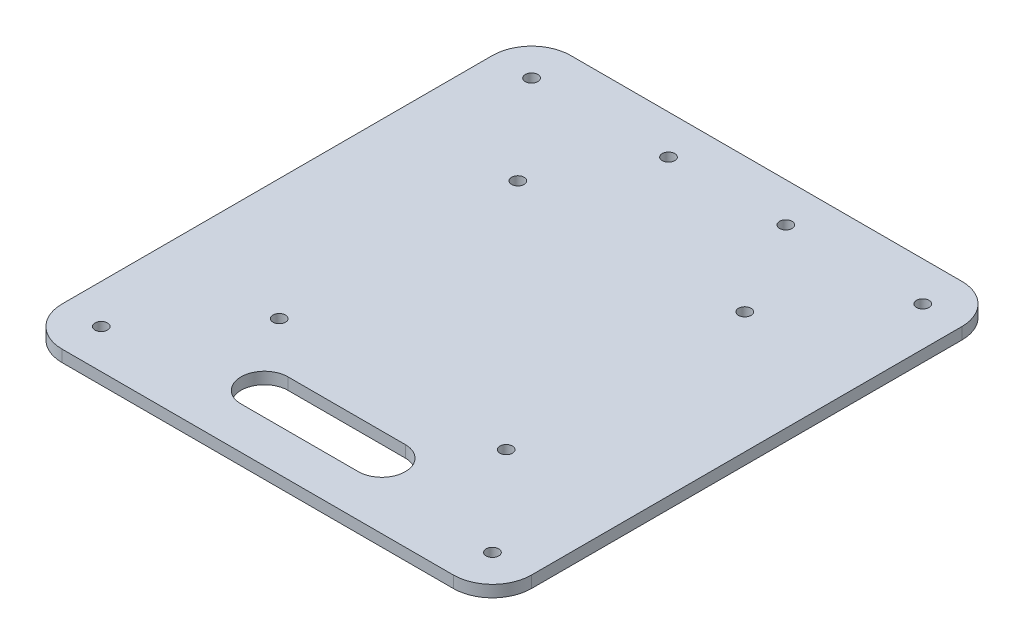
ISO-10303-21;
HEADER;
FILE_DESCRIPTION(('STEP AP214'),'2;1');
FILE_NAME('part.step','',(''),(''),'','','');
FILE_SCHEMA(('AUTOMOTIVE_DESIGN { 1 0 10303 214 1 1 1 1 }'));
ENDSEC;
DATA;
#1=APPLICATION_CONTEXT('core data for automotive mechanical design processes');
#2=APPLICATION_PROTOCOL_DEFINITION('international standard','automotive_design',2000,#1);
#3=PRODUCT_CONTEXT('',#1,'mechanical');
#4=PRODUCT('Part','Part','',(#3));
#5=PRODUCT_RELATED_PRODUCT_CATEGORY('part','',(#4));
#6=PRODUCT_DEFINITION_FORMATION('','',#4);
#7=PRODUCT_DEFINITION_CONTEXT('part definition',#1,'design');
#8=PRODUCT_DEFINITION('design','',#6,#7);
#9=PRODUCT_DEFINITION_SHAPE('','',#8);
#10=(LENGTH_UNIT() NAMED_UNIT(*) SI_UNIT(.MILLI.,.METRE.));
#11=(NAMED_UNIT(*) PLANE_ANGLE_UNIT() SI_UNIT($,.RADIAN.));
#12=(NAMED_UNIT(*) SI_UNIT($,.STERADIAN.) SOLID_ANGLE_UNIT());
#13=UNCERTAINTY_MEASURE_WITH_UNIT(LENGTH_MEASURE(1.E-05),#10,'distance_accuracy_value','');
#14=(GEOMETRIC_REPRESENTATION_CONTEXT(3) GLOBAL_UNCERTAINTY_ASSIGNED_CONTEXT((#13)) GLOBAL_UNIT_ASSIGNED_CONTEXT((#10,
#11,#12)) REPRESENTATION_CONTEXT('',''));
#15=CARTESIAN_POINT('',(0.,0.,0.));
#16=DIRECTION('',(0.,0.,1.));
#17=DIRECTION('',(1.,0.,0.));
#18=AXIS2_PLACEMENT_3D('',#15,#16,#17);
#19=CARTESIAN_POINT('',(-50.,3.,55.));
#20=DIRECTION('',(0.,1.,0.));
#21=DIRECTION('',(0.,0.,1.));
#22=AXIS2_PLACEMENT_3D('',#19,#20,#21);
#23=PLANE('',#22);
#24=CARTESIAN_POINT('',(-15.,3.,-55.));
#25=DIRECTION('',(0.,1.,0.));
#26=DIRECTION('',(0.,0.,1.));
#27=AXIS2_PLACEMENT_3D('',#24,#25,#26);
#28=CIRCLE('',#27,1.6);
#29=CARTESIAN_POINT('',(-15.,3.,-53.4));
#30=VERTEX_POINT('',#29);
#31=EDGE_CURVE('E407',#30,#30,#28,.T.);
#32=ORIENTED_EDGE('',*,*,#31,.F.);
#33=EDGE_LOOP('',(#32));
#34=FACE_BOUND('',#33,.T.);
#35=CARTESIAN_POINT('',(15.,3.,-55.));
#36=DIRECTION('',(0.,1.,0.));
#37=DIRECTION('',(0.,0.,1.));
#38=AXIS2_PLACEMENT_3D('',#35,#36,#37);
#39=CIRCLE('',#38,1.6);
#40=CARTESIAN_POINT('',(15.,3.,-53.4));
#41=VERTEX_POINT('',#40);
#42=EDGE_CURVE('E409',#41,#41,#39,.T.);
#43=ORIENTED_EDGE('',*,*,#42,.F.);
#44=EDGE_LOOP('',(#43));
#45=FACE_BOUND('',#44,.T.);
#46=CARTESIAN_POINT('',(-29.,3.,-30.5));
#47=DIRECTION('',(0.,1.,0.));
#48=DIRECTION('',(0.,0.,1.));
#49=AXIS2_PLACEMENT_3D('',#46,#47,#48);
#50=CIRCLE('',#49,1.6);
#51=CARTESIAN_POINT('',(-29.,3.,-32.1));
#52=VERTEX_POINT('',#51);
#53=EDGE_CURVE('E449',#52,#52,#50,.F.);
#54=ORIENTED_EDGE('',*,*,#53,.T.);
#55=EDGE_LOOP('',(#54));
#56=FACE_BOUND('',#55,.T.);
#57=CARTESIAN_POINT('',(29.,3.,30.5));
#58=DIRECTION('',(0.,1.,0.));
#59=DIRECTION('',(0.,0.,1.));
#60=AXIS2_PLACEMENT_3D('',#57,#58,#59);
#61=CIRCLE('',#60,1.6);
#62=CARTESIAN_POINT('',(29.,3.,28.9));
#63=VERTEX_POINT('',#62);
#64=EDGE_CURVE('E445',#63,#63,#61,.F.);
#65=ORIENTED_EDGE('',*,*,#64,.T.);
#66=EDGE_LOOP('',(#65));
#67=FACE_BOUND('',#66,.T.);
#68=CARTESIAN_POINT('',(-29.,3.,30.5));
#69=DIRECTION('',(0.,1.,0.));
#70=DIRECTION('',(0.,0.,1.));
#71=AXIS2_PLACEMENT_3D('',#68,#69,#70);
#72=CIRCLE('',#71,1.6);
#73=CARTESIAN_POINT('',(-29.,3.,28.9));
#74=VERTEX_POINT('',#73);
#75=EDGE_CURVE('E441',#74,#74,#72,.F.);
#76=ORIENTED_EDGE('',*,*,#75,.T.);
#77=EDGE_LOOP('',(#76));
#78=FACE_BOUND('',#77,.T.);
#79=CARTESIAN_POINT('',(29.,3.,-30.5));
#80=DIRECTION('',(0.,1.,0.));
#81=DIRECTION('',(0.,0.,1.));
#82=AXIS2_PLACEMENT_3D('',#79,#80,#81);
#83=CIRCLE('',#82,1.6);
#84=CARTESIAN_POINT('',(29.,3.,-32.1));
#85=VERTEX_POINT('',#84);
#86=EDGE_CURVE('E437',#85,#85,#83,.F.);
#87=ORIENTED_EDGE('',*,*,#86,.T.);
#88=EDGE_LOOP('',(#87));
#89=FACE_BOUND('',#88,.T.);
#90=CARTESIAN_POINT('',(-50.,3.,-55.));
#91=DIRECTION('',(0.,1.,0.));
#92=DIRECTION('',(0.,0.,-1.));
#93=AXIS2_PLACEMENT_3D('',#90,#91,#92);
#94=CIRCLE('',#93,1.59999999999997);
#95=CARTESIAN_POINT('',(-50.,3.,-56.6));
#96=VERTEX_POINT('',#95);
#97=EDGE_CURVE('E169',#96,#96,#94,.T.);
#98=ORIENTED_EDGE('',*,*,#97,.F.);
#99=EDGE_LOOP('',(#98));
#100=FACE_BOUND('',#99,.T.);
#101=CARTESIAN_POINT('',(50.,3.,-55.));
#102=DIRECTION('',(0.,1.,0.));
#103=DIRECTION('',(0.,0.,1.));
#104=AXIS2_PLACEMENT_3D('',#101,#102,#103);
#105=CIRCLE('',#104,1.6);
#106=CARTESIAN_POINT('',(50.,3.,-53.4));
#107=VERTEX_POINT('',#106);
#108=EDGE_CURVE('E193',#107,#107,#105,.T.);
#109=ORIENTED_EDGE('',*,*,#108,.F.);
#110=EDGE_LOOP('',(#109));
#111=FACE_BOUND('',#110,.T.);
#112=CARTESIAN_POINT('',(-50.,3.,55.));
#113=DIRECTION('',(0.,1.,0.));
#114=DIRECTION('',(0.,0.,1.));
#115=AXIS2_PLACEMENT_3D('',#112,#113,#114);
#116=CIRCLE('',#115,9.99999999999999);
#117=CARTESIAN_POINT('',(-60.,3.,54.9999999999999));
#118=VERTEX_POINT('',#117);
#119=CARTESIAN_POINT('',(-49.9999999999999,3.,65.));
#120=VERTEX_POINT('',#119);
#121=EDGE_CURVE('E201',#118,#120,#116,.T.);
#122=ORIENTED_EDGE('',*,*,#121,.T.);
#123=DIRECTION('',(1.,0.,0.));
#124=VECTOR('',#123,1.);
#125=CARTESIAN_POINT('',(-49.9999999999999,3.,65.));
#126=LINE('',#125,#124);
#127=CARTESIAN_POINT('',(49.9999999999999,3.,65.));
#128=VERTEX_POINT('',#127);
#129=EDGE_CURVE('E205',#120,#128,#126,.T.);
#130=ORIENTED_EDGE('',*,*,#129,.T.);
#131=CARTESIAN_POINT('',(50.,3.,55.));
#132=DIRECTION('',(0.,1.,0.));
#133=DIRECTION('',(0.,0.,1.));
#134=AXIS2_PLACEMENT_3D('',#131,#132,#133);
#135=CIRCLE('',#134,9.99999999999999);
#136=CARTESIAN_POINT('',(60.,3.,54.9999999999999));
#137=VERTEX_POINT('',#136);
#138=EDGE_CURVE('E209',#128,#137,#135,.T.);
#139=ORIENTED_EDGE('',*,*,#138,.T.);
#140=DIRECTION('',(0.,0.,-1.));
#141=VECTOR('',#140,1.);
#142=CARTESIAN_POINT('',(60.,3.,-54.9999999999999));
#143=LINE('',#142,#141);
#144=CARTESIAN_POINT('',(60.,3.,-54.9999999999999));
#145=VERTEX_POINT('',#144);
#146=EDGE_CURVE('E212',#137,#145,#143,.T.);
#147=ORIENTED_EDGE('',*,*,#146,.T.);
#148=CARTESIAN_POINT('',(50.,3.,-55.));
#149=DIRECTION('',(0.,1.,0.));
#150=DIRECTION('',(0.,0.,-1.));
#151=AXIS2_PLACEMENT_3D('',#148,#149,#150);
#152=CIRCLE('',#151,9.99999999999999);
#153=CARTESIAN_POINT('',(49.9999999999999,3.,-65.));
#154=VERTEX_POINT('',#153);
#155=EDGE_CURVE('E215',#145,#154,#152,.T.);
#156=ORIENTED_EDGE('',*,*,#155,.T.);
#157=DIRECTION('',(-1.,0.,0.));
#158=VECTOR('',#157,1.);
#159=CARTESIAN_POINT('',(-49.9999999999999,3.,-65.));
#160=LINE('',#159,#158);
#161=CARTESIAN_POINT('',(-49.9999999999999,3.,-65.));
#162=VERTEX_POINT('',#161);
#163=EDGE_CURVE('E218',#154,#162,#160,.T.);
#164=ORIENTED_EDGE('',*,*,#163,.T.);
#165=CARTESIAN_POINT('',(-50.,3.,-55.));
#166=DIRECTION('',(0.,1.,0.));
#167=DIRECTION('',(0.,0.,1.));
#168=AXIS2_PLACEMENT_3D('',#165,#166,#167);
#169=CIRCLE('',#168,9.99999999999999);
#170=CARTESIAN_POINT('',(-60.,3.,-54.9999999999999));
#171=VERTEX_POINT('',#170);
#172=EDGE_CURVE('E221',#162,#171,#169,.T.);
#173=ORIENTED_EDGE('',*,*,#172,.T.);
#174=DIRECTION('',(0.,0.,1.));
#175=VECTOR('',#174,1.);
#176=CARTESIAN_POINT('',(-60.,3.,-54.9999999999999));
#177=LINE('',#176,#175);
#178=EDGE_CURVE('E224',#171,#118,#177,.T.);
#179=ORIENTED_EDGE('',*,*,#178,.T.);
#180=EDGE_LOOP('',(#122,#130,#139,#147,#156,#164,#173,#179));
#181=FACE_BOUND('',#180,.T.);
#182=CARTESIAN_POINT('',(-50.,3.,55.));
#183=DIRECTION('',(0.,1.,0.));
#184=DIRECTION('',(0.,0.,1.));
#185=AXIS2_PLACEMENT_3D('',#182,#183,#184);
#186=CIRCLE('',#185,1.60000000000008);
#187=CARTESIAN_POINT('',(-50.,3.,56.6000000000001));
#188=VERTEX_POINT('',#187);
#189=EDGE_CURVE('E185',#188,#188,#186,.T.);
#190=ORIENTED_EDGE('',*,*,#189,.F.);
#191=EDGE_LOOP('',(#190));
#192=FACE_BOUND('',#191,.T.);
#193=DIRECTION('',(1.,0.,0.));
#194=VECTOR('',#193,1.);
#195=CARTESIAN_POINT('',(-15.,3.,54.2679851551916));
#196=LINE('',#195,#194);
#197=CARTESIAN_POINT('',(-15.,3.,54.2679851551916));
#198=VERTEX_POINT('',#197);
#199=CARTESIAN_POINT('',(15.,3.,54.2679851551916));
#200=VERTEX_POINT('',#199);
#201=EDGE_CURVE('E143',#198,#200,#196,.T.);
#202=ORIENTED_EDGE('',*,*,#201,.F.);
#203=CARTESIAN_POINT('',(-15.,3.,48.2679851551916));
#204=DIRECTION('',(0.,1.,0.));
#205=DIRECTION('',(0.,0.,1.));
#206=AXIS2_PLACEMENT_3D('',#203,#204,#205);
#207=CIRCLE('',#206,6.);
#208=CARTESIAN_POINT('',(-15.,3.,42.2679851551916));
#209=VERTEX_POINT('',#208);
#210=EDGE_CURVE('E134',#209,#198,#207,.T.);
#211=ORIENTED_EDGE('',*,*,#210,.F.);
#212=DIRECTION('',(-1.,0.,0.));
#213=VECTOR('',#212,1.);
#214=CARTESIAN_POINT('',(-15.,3.,42.2679851551916));
#215=LINE('',#214,#213);
#216=CARTESIAN_POINT('',(15.,3.,42.2679851551916));
#217=VERTEX_POINT('',#216);
#218=EDGE_CURVE('E161',#217,#209,#215,.T.);
#219=ORIENTED_EDGE('',*,*,#218,.F.);
#220=CARTESIAN_POINT('',(15.,3.,48.2679851551916));
#221=DIRECTION('',(0.,1.,0.));
#222=DIRECTION('',(0.,0.,1.));
#223=AXIS2_PLACEMENT_3D('',#220,#221,#222);
#224=CIRCLE('',#223,6.);
#225=EDGE_CURVE('E157',#200,#217,#224,.T.);
#226=ORIENTED_EDGE('',*,*,#225,.F.);
#227=EDGE_LOOP('',(#202,#211,#219,#226));
#228=FACE_BOUND('',#227,.T.);
#229=CARTESIAN_POINT('',(50.,3.,55.));
#230=DIRECTION('',(0.,1.,0.));
#231=DIRECTION('',(0.,0.,-1.));
#232=AXIS2_PLACEMENT_3D('',#229,#230,#231);
#233=CIRCLE('',#232,1.60000000000001);
#234=CARTESIAN_POINT('',(50.,3.,53.4));
#235=VERTEX_POINT('',#234);
#236=EDGE_CURVE('E454',#235,#235,#233,.T.);
#237=ORIENTED_EDGE('',*,*,#236,.F.);
#238=EDGE_LOOP('',(#237));
#239=FACE_BOUND('',#238,.T.);
#240=ADVANCED_FACE('F44',(#34,#45,#56,#67,#78,#89,#100,#111,#181,#192,#228,#239),#23,.T.);
#241=CARTESIAN_POINT('',(-50.,0.,55.));
#242=DIRECTION('',(0.,1.,0.));
#243=DIRECTION('',(0.,0.,1.));
#244=AXIS2_PLACEMENT_3D('',#241,#242,#243);
#245=PLANE('',#244);
#246=CARTESIAN_POINT('',(-15.,0.,-55.));
#247=DIRECTION('',(0.,1.,0.));
#248=DIRECTION('',(0.,0.,1.));
#249=AXIS2_PLACEMENT_3D('',#246,#247,#248);
#250=CIRCLE('',#249,1.6);
#251=CARTESIAN_POINT('',(-15.,0.,-53.4));
#252=VERTEX_POINT('',#251);
#253=EDGE_CURVE('E405',#252,#252,#250,.T.);
#254=ORIENTED_EDGE('',*,*,#253,.T.);
#255=EDGE_LOOP('',(#254));
#256=FACE_BOUND('',#255,.T.);
#257=CARTESIAN_POINT('',(15.,0.,-55.));
#258=DIRECTION('',(0.,1.,0.));
#259=DIRECTION('',(0.,0.,1.));
#260=AXIS2_PLACEMENT_3D('',#257,#258,#259);
#261=CIRCLE('',#260,1.6);
#262=CARTESIAN_POINT('',(15.,0.,-53.4));
#263=VERTEX_POINT('',#262);
#264=EDGE_CURVE('E416',#263,#263,#261,.T.);
#265=ORIENTED_EDGE('',*,*,#264,.T.);
#266=EDGE_LOOP('',(#265));
#267=FACE_BOUND('',#266,.T.);
#268=CARTESIAN_POINT('',(-29.,0.,-30.5));
#269=DIRECTION('',(0.,1.,0.));
#270=DIRECTION('',(0.,0.,1.));
#271=AXIS2_PLACEMENT_3D('',#268,#269,#270);
#272=CIRCLE('',#271,1.6);
#273=CARTESIAN_POINT('',(-29.,0.,-32.1));
#274=VERTEX_POINT('',#273);
#275=EDGE_CURVE('E426',#274,#274,#272,.T.);
#276=ORIENTED_EDGE('',*,*,#275,.T.);
#277=EDGE_LOOP('',(#276));
#278=FACE_BOUND('',#277,.T.);
#279=CARTESIAN_POINT('',(29.,0.,30.5));
#280=DIRECTION('',(0.,1.,0.));
#281=DIRECTION('',(0.,0.,1.));
#282=AXIS2_PLACEMENT_3D('',#279,#280,#281);
#283=CIRCLE('',#282,1.6);
#284=CARTESIAN_POINT('',(29.,0.,28.9));
#285=VERTEX_POINT('',#284);
#286=EDGE_CURVE('E425',#285,#285,#283,.T.);
#287=ORIENTED_EDGE('',*,*,#286,.T.);
#288=EDGE_LOOP('',(#287));
#289=FACE_BOUND('',#288,.T.);
#290=CARTESIAN_POINT('',(-29.,0.,30.5));
#291=DIRECTION('',(0.,1.,0.));
#292=DIRECTION('',(0.,0.,1.));
#293=AXIS2_PLACEMENT_3D('',#290,#291,#292);
#294=CIRCLE('',#293,1.6);
#295=CARTESIAN_POINT('',(-29.,0.,28.9));
#296=VERTEX_POINT('',#295);
#297=EDGE_CURVE('E413',#296,#296,#294,.T.);
#298=ORIENTED_EDGE('',*,*,#297,.T.);
#299=EDGE_LOOP('',(#298));
#300=FACE_BOUND('',#299,.T.);
#301=CARTESIAN_POINT('',(29.,0.,-30.5));
#302=DIRECTION('',(0.,1.,0.));
#303=DIRECTION('',(0.,0.,1.));
#304=AXIS2_PLACEMENT_3D('',#301,#302,#303);
#305=CIRCLE('',#304,1.6);
#306=CARTESIAN_POINT('',(29.,0.,-32.1));
#307=VERTEX_POINT('',#306);
#308=EDGE_CURVE('E430',#307,#307,#305,.T.);
#309=ORIENTED_EDGE('',*,*,#308,.T.);
#310=EDGE_LOOP('',(#309));
#311=FACE_BOUND('',#310,.T.);
#312=CARTESIAN_POINT('',(-50.,0.,55.));
#313=DIRECTION('',(0.,1.,0.));
#314=DIRECTION('',(0.,0.,1.));
#315=AXIS2_PLACEMENT_3D('',#312,#313,#314);
#316=CIRCLE('',#315,1.60000000000008);
#317=CARTESIAN_POINT('',(-50.,0.,56.6000000000001));
#318=VERTEX_POINT('',#317);
#319=EDGE_CURVE('E152',#318,#318,#316,.T.);
#320=ORIENTED_EDGE('',*,*,#319,.T.);
#321=EDGE_LOOP('',(#320));
#322=FACE_BOUND('',#321,.T.);
#323=CARTESIAN_POINT('',(50.,0.,-55.));
#324=DIRECTION('',(0.,1.,0.));
#325=DIRECTION('',(0.,0.,1.));
#326=AXIS2_PLACEMENT_3D('',#323,#324,#325);
#327=CIRCLE('',#326,1.6);
#328=CARTESIAN_POINT('',(50.,0.,-53.4));
#329=VERTEX_POINT('',#328);
#330=EDGE_CURVE('E189',#329,#329,#327,.T.);
#331=ORIENTED_EDGE('',*,*,#330,.T.);
#332=EDGE_LOOP('',(#331));
#333=FACE_BOUND('',#332,.T.);
#334=CARTESIAN_POINT('',(-50.,0.,55.));
#335=DIRECTION('',(0.,1.,0.));
#336=DIRECTION('',(0.,0.,1.));
#337=AXIS2_PLACEMENT_3D('',#334,#335,#336);
#338=CIRCLE('',#337,9.99999999999999);
#339=CARTESIAN_POINT('',(-60.,0.,54.9999999999999));
#340=VERTEX_POINT('',#339);
#341=CARTESIAN_POINT('',(-49.9999999999999,0.,65.));
#342=VERTEX_POINT('',#341);
#343=EDGE_CURVE('E197',#340,#342,#338,.T.);
#344=ORIENTED_EDGE('',*,*,#343,.F.);
#345=DIRECTION('',(0.,0.,1.));
#346=VECTOR('',#345,1.);
#347=CARTESIAN_POINT('',(-60.,0.,-54.9999999999999));
#348=LINE('',#347,#346);
#349=CARTESIAN_POINT('',(-60.,0.,-54.9999999999999));
#350=VERTEX_POINT('',#349);
#351=EDGE_CURVE('E206',#350,#340,#348,.T.);
#352=ORIENTED_EDGE('',*,*,#351,.F.);
#353=CARTESIAN_POINT('',(-50.,0.,-55.));
#354=DIRECTION('',(0.,1.,0.));
#355=DIRECTION('',(0.,0.,1.));
#356=AXIS2_PLACEMENT_3D('',#353,#354,#355);
#357=CIRCLE('',#356,9.99999999999999);
#358=CARTESIAN_POINT('',(-49.9999999999999,0.,-65.));
#359=VERTEX_POINT('',#358);
#360=EDGE_CURVE('E246',#359,#350,#357,.T.);
#361=ORIENTED_EDGE('',*,*,#360,.F.);
#362=DIRECTION('',(-1.,0.,0.));
#363=VECTOR('',#362,1.);
#364=CARTESIAN_POINT('',(-49.9999999999999,0.,-65.));
#365=LINE('',#364,#363);
#366=CARTESIAN_POINT('',(49.9999999999999,0.,-65.));
#367=VERTEX_POINT('',#366);
#368=EDGE_CURVE('E243',#367,#359,#365,.T.);
#369=ORIENTED_EDGE('',*,*,#368,.F.);
#370=CARTESIAN_POINT('',(50.,0.,-55.));
#371=DIRECTION('',(0.,1.,0.));
#372=DIRECTION('',(0.,0.,-1.));
#373=AXIS2_PLACEMENT_3D('',#370,#371,#372);
#374=CIRCLE('',#373,9.99999999999999);
#375=CARTESIAN_POINT('',(60.,0.,-54.9999999999999));
#376=VERTEX_POINT('',#375);
#377=EDGE_CURVE('E240',#376,#367,#374,.T.);
#378=ORIENTED_EDGE('',*,*,#377,.F.);
#379=DIRECTION('',(0.,0.,-1.));
#380=VECTOR('',#379,1.);
#381=CARTESIAN_POINT('',(60.,0.,-54.9999999999999));
#382=LINE('',#381,#380);
#383=CARTESIAN_POINT('',(60.,0.,54.9999999999999));
#384=VERTEX_POINT('',#383);
#385=EDGE_CURVE('E237',#384,#376,#382,.T.);
#386=ORIENTED_EDGE('',*,*,#385,.F.);
#387=CARTESIAN_POINT('',(50.,0.,55.));
#388=DIRECTION('',(0.,1.,0.));
#389=DIRECTION('',(0.,0.,1.));
#390=AXIS2_PLACEMENT_3D('',#387,#388,#389);
#391=CIRCLE('',#390,9.99999999999999);
#392=CARTESIAN_POINT('',(49.9999999999999,0.,65.));
#393=VERTEX_POINT('',#392);
#394=EDGE_CURVE('E234',#393,#384,#391,.T.);
#395=ORIENTED_EDGE('',*,*,#394,.F.);
#396=DIRECTION('',(1.,0.,0.));
#397=VECTOR('',#396,1.);
#398=CARTESIAN_POINT('',(-49.9999999999999,0.,65.));
#399=LINE('',#398,#397);
#400=EDGE_CURVE('E231',#342,#393,#399,.T.);
#401=ORIENTED_EDGE('',*,*,#400,.F.);
#402=EDGE_LOOP('',(#344,#352,#361,#369,#378,#386,#395,#401));
#403=FACE_BOUND('',#402,.T.);
#404=CARTESIAN_POINT('',(-15.,0.,48.2679851551916));
#405=DIRECTION('',(0.,1.,0.));
#406=DIRECTION('',(0.,0.,1.));
#407=AXIS2_PLACEMENT_3D('',#404,#405,#406);
#408=CIRCLE('',#407,6.);
#409=CARTESIAN_POINT('',(-15.,0.,42.2679851551916));
#410=VERTEX_POINT('',#409);
#411=CARTESIAN_POINT('',(-15.,0.,54.2679851551916));
#412=VERTEX_POINT('',#411);
#413=EDGE_CURVE('E68',#410,#412,#408,.T.);
#414=ORIENTED_EDGE('',*,*,#413,.T.);
#415=DIRECTION('',(1.,0.,0.));
#416=VECTOR('',#415,1.);
#417=CARTESIAN_POINT('',(-15.,0.,54.2679851551916));
#418=LINE('',#417,#416);
#419=CARTESIAN_POINT('',(15.,0.,54.2679851551916));
#420=VERTEX_POINT('',#419);
#421=EDGE_CURVE('E150',#412,#420,#418,.T.);
#422=ORIENTED_EDGE('',*,*,#421,.T.);
#423=CARTESIAN_POINT('',(15.,0.,48.2679851551916));
#424=DIRECTION('',(0.,1.,0.));
#425=DIRECTION('',(0.,0.,1.));
#426=AXIS2_PLACEMENT_3D('',#423,#424,#425);
#427=CIRCLE('',#426,6.);
#428=CARTESIAN_POINT('',(15.,0.,42.2679851551916));
#429=VERTEX_POINT('',#428);
#430=EDGE_CURVE('E172',#420,#429,#427,.T.);
#431=ORIENTED_EDGE('',*,*,#430,.T.);
#432=DIRECTION('',(-1.,0.,0.));
#433=VECTOR('',#432,1.);
#434=CARTESIAN_POINT('',(-15.,0.,42.2679851551916));
#435=LINE('',#434,#433);
#436=EDGE_CURVE('E144',#429,#410,#435,.T.);
#437=ORIENTED_EDGE('',*,*,#436,.T.);
#438=EDGE_LOOP('',(#414,#422,#431,#437));
#439=FACE_BOUND('',#438,.T.);
#440=CARTESIAN_POINT('',(-50.,0.,-55.));
#441=DIRECTION('',(0.,1.,0.));
#442=DIRECTION('',(0.,0.,-1.));
#443=AXIS2_PLACEMENT_3D('',#440,#441,#442);
#444=CIRCLE('',#443,1.59999999999997);
#445=CARTESIAN_POINT('',(-50.,0.,-56.6));
#446=VERTEX_POINT('',#445);
#447=EDGE_CURVE('E458',#446,#446,#444,.T.);
#448=ORIENTED_EDGE('',*,*,#447,.T.);
#449=EDGE_LOOP('',(#448));
#450=FACE_BOUND('',#449,.T.);
#451=CARTESIAN_POINT('',(50.,0.,55.));
#452=DIRECTION('',(0.,1.,0.));
#453=DIRECTION('',(0.,0.,-1.));
#454=AXIS2_PLACEMENT_3D('',#451,#452,#453);
#455=CIRCLE('',#454,1.60000000000001);
#456=CARTESIAN_POINT('',(50.,0.,53.4));
#457=VERTEX_POINT('',#456);
#458=EDGE_CURVE('E453',#457,#457,#455,.T.);
#459=ORIENTED_EDGE('',*,*,#458,.T.);
#460=EDGE_LOOP('',(#459));
#461=FACE_BOUND('',#460,.T.);
#462=ADVANCED_FACE('F285',(#256,#267,#278,#289,#300,#311,#322,#333,#403,#439,#450,#461),#245,.F.);
#463=CARTESIAN_POINT('',(-50.,3.,55.));
#464=DIRECTION('',(0.,-1.,0.));
#465=DIRECTION('',(0.,0.,-1.));
#466=AXIS2_PLACEMENT_3D('',#463,#464,#465);
#467=CYLINDRICAL_SURFACE('',#466,9.99999999999999);
#468=ORIENTED_EDGE('',*,*,#343,.T.);
#469=DIRECTION('',(0.,-1.,0.));
#470=VECTOR('',#469,1.);
#471=CARTESIAN_POINT('',(-49.9999999999999,3.,65.));
#472=LINE('',#471,#470);
#473=EDGE_CURVE('E11',#120,#342,#472,.T.);
#474=ORIENTED_EDGE('',*,*,#473,.F.);
#475=ORIENTED_EDGE('',*,*,#121,.F.);
#476=DIRECTION('',(0.,-1.,0.));
#477=VECTOR('',#476,1.);
#478=CARTESIAN_POINT('',(-60.,3.,54.9999999999999));
#479=LINE('',#478,#477);
#480=EDGE_CURVE('E227',#118,#340,#479,.T.);
#481=ORIENTED_EDGE('',*,*,#480,.T.);
#482=EDGE_LOOP('',(#468,#474,#475,#481));
#483=FACE_BOUND('',#482,.T.);
#484=ADVANCED_FACE('F46',(#483),#467,.T.);
#485=CARTESIAN_POINT('',(-49.9999999999999,3.,65.));
#486=DIRECTION('',(0.,0.,-1.));
#487=DIRECTION('',(-1.,0.,0.));
#488=AXIS2_PLACEMENT_3D('',#485,#486,#487);
#489=PLANE('',#488);
#490=ORIENTED_EDGE('',*,*,#400,.T.);
#491=DIRECTION('',(0.,-1.,0.));
#492=VECTOR('',#491,1.);
#493=CARTESIAN_POINT('',(49.9999999999999,3.,65.));
#494=LINE('',#493,#492);
#495=EDGE_CURVE('E53',#128,#393,#494,.T.);
#496=ORIENTED_EDGE('',*,*,#495,.F.);
#497=ORIENTED_EDGE('',*,*,#129,.F.);
#498=ORIENTED_EDGE('',*,*,#473,.T.);
#499=EDGE_LOOP('',(#490,#496,#497,#498));
#500=FACE_BOUND('',#499,.T.);
#501=ADVANCED_FACE('F303',(#500),#489,.F.);
#502=CARTESIAN_POINT('',(50.,3.,55.));
#503=DIRECTION('',(0.,-1.,0.));
#504=DIRECTION('',(0.,0.,-1.));
#505=AXIS2_PLACEMENT_3D('',#502,#503,#504);
#506=CYLINDRICAL_SURFACE('',#505,9.99999999999999);
#507=ORIENTED_EDGE('',*,*,#394,.T.);
#508=DIRECTION('',(0.,-1.,0.));
#509=VECTOR('',#508,1.);
#510=CARTESIAN_POINT('',(60.,3.,54.9999999999999));
#511=LINE('',#510,#509);
#512=EDGE_CURVE('E270',#137,#384,#511,.T.);
#513=ORIENTED_EDGE('',*,*,#512,.F.);
#514=ORIENTED_EDGE('',*,*,#138,.F.);
#515=ORIENTED_EDGE('',*,*,#495,.T.);
#516=EDGE_LOOP('',(#507,#513,#514,#515));
#517=FACE_BOUND('',#516,.T.);
#518=ADVANCED_FACE('F279',(#517),#506,.T.);
#519=CARTESIAN_POINT('',(60.,3.,-54.9999999999999));
#520=DIRECTION('',(-1.,0.,0.));
#521=DIRECTION('',(0.,0.,1.));
#522=AXIS2_PLACEMENT_3D('',#519,#520,#521);
#523=PLANE('',#522);
#524=ORIENTED_EDGE('',*,*,#385,.T.);
#525=DIRECTION('',(0.,-1.,0.));
#526=VECTOR('',#525,1.);
#527=CARTESIAN_POINT('',(60.,3.,-54.9999999999999));
#528=LINE('',#527,#526);
#529=EDGE_CURVE('E266',#145,#376,#528,.T.);
#530=ORIENTED_EDGE('',*,*,#529,.F.);
#531=ORIENTED_EDGE('',*,*,#146,.F.);
#532=ORIENTED_EDGE('',*,*,#512,.T.);
#533=EDGE_LOOP('',(#524,#530,#531,#532));
#534=FACE_BOUND('',#533,.T.);
#535=ADVANCED_FACE('F291',(#534),#523,.F.);
#536=CARTESIAN_POINT('',(50.,3.,-55.));
#537=DIRECTION('',(0.,-1.,0.));
#538=DIRECTION('',(0.,0.,-1.));
#539=AXIS2_PLACEMENT_3D('',#536,#537,#538);
#540=CYLINDRICAL_SURFACE('',#539,9.99999999999999);
#541=ORIENTED_EDGE('',*,*,#377,.T.);
#542=DIRECTION('',(0.,-1.,0.));
#543=VECTOR('',#542,1.);
#544=CARTESIAN_POINT('',(49.9999999999999,3.,-65.));
#545=LINE('',#544,#543);
#546=EDGE_CURVE('E262',#154,#367,#545,.T.);
#547=ORIENTED_EDGE('',*,*,#546,.F.);
#548=ORIENTED_EDGE('',*,*,#155,.F.);
#549=ORIENTED_EDGE('',*,*,#529,.T.);
#550=EDGE_LOOP('',(#541,#547,#548,#549));
#551=FACE_BOUND('',#550,.T.);
#552=ADVANCED_FACE('F295',(#551),#540,.T.);
#553=CARTESIAN_POINT('',(-49.9999999999999,3.,-65.));
#554=DIRECTION('',(0.,0.,1.));
#555=DIRECTION('',(1.,0.,0.));
#556=AXIS2_PLACEMENT_3D('',#553,#554,#555);
#557=PLANE('',#556);
#558=ORIENTED_EDGE('',*,*,#368,.T.);
#559=DIRECTION('',(0.,-1.,0.));
#560=VECTOR('',#559,1.);
#561=CARTESIAN_POINT('',(-49.9999999999999,3.,-65.));
#562=LINE('',#561,#560);
#563=EDGE_CURVE('E258',#162,#359,#562,.T.);
#564=ORIENTED_EDGE('',*,*,#563,.F.);
#565=ORIENTED_EDGE('',*,*,#163,.F.);
#566=ORIENTED_EDGE('',*,*,#546,.T.);
#567=EDGE_LOOP('',(#558,#564,#565,#566));
#568=FACE_BOUND('',#567,.T.);
#569=ADVANCED_FACE('F316',(#568),#557,.F.);
#570=CARTESIAN_POINT('',(-50.,3.,-55.));
#571=DIRECTION('',(0.,-1.,0.));
#572=DIRECTION('',(0.,0.,-1.));
#573=AXIS2_PLACEMENT_3D('',#570,#571,#572);
#574=CYLINDRICAL_SURFACE('',#573,9.99999999999999);
#575=ORIENTED_EDGE('',*,*,#360,.T.);
#576=DIRECTION('',(0.,-1.,0.));
#577=VECTOR('',#576,1.);
#578=CARTESIAN_POINT('',(-60.,3.,-54.9999999999999));
#579=LINE('',#578,#577);
#580=EDGE_CURVE('E254',#171,#350,#579,.T.);
#581=ORIENTED_EDGE('',*,*,#580,.F.);
#582=ORIENTED_EDGE('',*,*,#172,.F.);
#583=ORIENTED_EDGE('',*,*,#563,.T.);
#584=EDGE_LOOP('',(#575,#581,#582,#583));
#585=FACE_BOUND('',#584,.T.);
#586=ADVANCED_FACE('F314',(#585),#574,.T.);
#587=CARTESIAN_POINT('',(-60.,3.,-54.9999999999999));
#588=DIRECTION('',(1.,0.,0.));
#589=DIRECTION('',(0.,0.,-1.));
#590=AXIS2_PLACEMENT_3D('',#587,#588,#589);
#591=PLANE('',#590);
#592=ORIENTED_EDGE('',*,*,#351,.T.);
#593=ORIENTED_EDGE('',*,*,#480,.F.);
#594=ORIENTED_EDGE('',*,*,#178,.F.);
#595=ORIENTED_EDGE('',*,*,#580,.T.);
#596=EDGE_LOOP('',(#592,#593,#594,#595));
#597=FACE_BOUND('',#596,.T.);
#598=ADVANCED_FACE('F309',(#597),#591,.F.);
#599=CARTESIAN_POINT('',(50.,3.,-55.));
#600=DIRECTION('',(0.,-1.,0.));
#601=DIRECTION('',(0.,0.,-1.));
#602=AXIS2_PLACEMENT_3D('',#599,#600,#601);
#603=CYLINDRICAL_SURFACE('',#602,1.6);
#604=ORIENTED_EDGE('',*,*,#108,.T.);
#605=EDGE_LOOP('',(#604));
#606=FACE_BOUND('',#605,.T.);
#607=ORIENTED_EDGE('',*,*,#330,.F.);
#608=EDGE_LOOP('',(#607));
#609=FACE_BOUND('',#608,.T.);
#610=ADVANCED_FACE('F337',(#606,#609),#603,.F.);
#611=CARTESIAN_POINT('',(-50.,3.,55.));
#612=DIRECTION('',(0.,-1.,0.));
#613=DIRECTION('',(0.,0.,-1.));
#614=AXIS2_PLACEMENT_3D('',#611,#612,#613);
#615=CYLINDRICAL_SURFACE('',#614,1.60000000000008);
#616=ORIENTED_EDGE('',*,*,#189,.T.);
#617=EDGE_LOOP('',(#616));
#618=FACE_BOUND('',#617,.T.);
#619=ORIENTED_EDGE('',*,*,#319,.F.);
#620=EDGE_LOOP('',(#619));
#621=FACE_BOUND('',#620,.T.);
#622=ADVANCED_FACE('F344',(#618,#621),#615,.F.);
#623=CARTESIAN_POINT('',(-15.,3.,48.2679851551916));
#624=DIRECTION('',(0.,-1.,0.));
#625=DIRECTION('',(0.,0.,-1.));
#626=AXIS2_PLACEMENT_3D('',#623,#624,#625);
#627=CYLINDRICAL_SURFACE('',#626,6.);
#628=ORIENTED_EDGE('',*,*,#413,.F.);
#629=DIRECTION('',(0.,-1.,0.));
#630=VECTOR('',#629,1.);
#631=CARTESIAN_POINT('',(-15.,3.,42.2679851551916));
#632=LINE('',#631,#630);
#633=EDGE_CURVE('E138',#209,#410,#632,.T.);
#634=ORIENTED_EDGE('',*,*,#633,.F.);
#635=ORIENTED_EDGE('',*,*,#210,.T.);
#636=DIRECTION('',(0.,-1.,0.));
#637=VECTOR('',#636,1.);
#638=CARTESIAN_POINT('',(-15.,3.,54.2679851551916));
#639=LINE('',#638,#637);
#640=EDGE_CURVE('E137',#198,#412,#639,.T.);
#641=ORIENTED_EDGE('',*,*,#640,.T.);
#642=EDGE_LOOP('',(#628,#634,#635,#641));
#643=FACE_BOUND('',#642,.T.);
#644=ADVANCED_FACE('F136',(#643),#627,.F.);
#645=CARTESIAN_POINT('',(-15.,3.,54.2679851551916));
#646=DIRECTION('',(0.,0.,-1.));
#647=DIRECTION('',(-1.,0.,0.));
#648=AXIS2_PLACEMENT_3D('',#645,#646,#647);
#649=PLANE('',#648);
#650=ORIENTED_EDGE('',*,*,#421,.F.);
#651=ORIENTED_EDGE('',*,*,#640,.F.);
#652=ORIENTED_EDGE('',*,*,#201,.T.);
#653=DIRECTION('',(0.,-1.,0.));
#654=VECTOR('',#653,1.);
#655=CARTESIAN_POINT('',(15.,3.,54.2679851551916));
#656=LINE('',#655,#654);
#657=EDGE_CURVE('E153',#200,#420,#656,.T.);
#658=ORIENTED_EDGE('',*,*,#657,.T.);
#659=EDGE_LOOP('',(#650,#651,#652,#658));
#660=FACE_BOUND('',#659,.T.);
#661=ADVANCED_FACE('F147',(#660),#649,.T.);
#662=CARTESIAN_POINT('',(15.,3.,48.2679851551916));
#663=DIRECTION('',(0.,-1.,0.));
#664=DIRECTION('',(0.,0.,-1.));
#665=AXIS2_PLACEMENT_3D('',#662,#663,#664);
#666=CYLINDRICAL_SURFACE('',#665,6.);
#667=ORIENTED_EDGE('',*,*,#430,.F.);
#668=ORIENTED_EDGE('',*,*,#657,.F.);
#669=ORIENTED_EDGE('',*,*,#225,.T.);
#670=DIRECTION('',(0.,-1.,0.));
#671=VECTOR('',#670,1.);
#672=CARTESIAN_POINT('',(15.,3.,42.2679851551916));
#673=LINE('',#672,#671);
#674=EDGE_CURVE('E60',#217,#429,#673,.T.);
#675=ORIENTED_EDGE('',*,*,#674,.T.);
#676=EDGE_LOOP('',(#667,#668,#669,#675));
#677=FACE_BOUND('',#676,.T.);
#678=ADVANCED_FACE('F363',(#677),#666,.F.);
#679=CARTESIAN_POINT('',(-15.,3.,42.2679851551916));
#680=DIRECTION('',(0.,0.,1.));
#681=DIRECTION('',(1.,0.,0.));
#682=AXIS2_PLACEMENT_3D('',#679,#680,#681);
#683=PLANE('',#682);
#684=ORIENTED_EDGE('',*,*,#436,.F.);
#685=ORIENTED_EDGE('',*,*,#674,.F.);
#686=ORIENTED_EDGE('',*,*,#218,.T.);
#687=ORIENTED_EDGE('',*,*,#633,.T.);
#688=EDGE_LOOP('',(#684,#685,#686,#687));
#689=FACE_BOUND('',#688,.T.);
#690=ADVANCED_FACE('F366',(#689),#683,.T.);
#691=CARTESIAN_POINT('',(-50.,3.,-55.));
#692=DIRECTION('',(0.,-1.,0.));
#693=DIRECTION('',(0.,0.,-1.));
#694=AXIS2_PLACEMENT_3D('',#691,#692,#693);
#695=CYLINDRICAL_SURFACE('',#694,1.59999999999997);
#696=ORIENTED_EDGE('',*,*,#97,.T.);
#697=EDGE_LOOP('',(#696));
#698=FACE_BOUND('',#697,.T.);
#699=ORIENTED_EDGE('',*,*,#447,.F.);
#700=EDGE_LOOP('',(#699));
#701=FACE_BOUND('',#700,.T.);
#702=ADVANCED_FACE('F370',(#698,#701),#695,.F.);
#703=CARTESIAN_POINT('',(50.,3.,55.));
#704=DIRECTION('',(0.,-1.,0.));
#705=DIRECTION('',(0.,0.,-1.));
#706=AXIS2_PLACEMENT_3D('',#703,#704,#705);
#707=CYLINDRICAL_SURFACE('',#706,1.60000000000001);
#708=ORIENTED_EDGE('',*,*,#236,.T.);
#709=EDGE_LOOP('',(#708));
#710=FACE_BOUND('',#709,.T.);
#711=ORIENTED_EDGE('',*,*,#458,.F.);
#712=EDGE_LOOP('',(#711));
#713=FACE_BOUND('',#712,.T.);
#714=ADVANCED_FACE('F373',(#710,#713),#707,.F.);
#715=CARTESIAN_POINT('',(29.,45.,-30.5));
#716=DIRECTION('',(0.,-1.,0.));
#717=DIRECTION('',(0.,0.,-1.));
#718=AXIS2_PLACEMENT_3D('',#715,#716,#717);
#719=CYLINDRICAL_SURFACE('',#718,1.6);
#720=CARTESIAN_POINT('',(29.,3.,-32.1));
#721=CARTESIAN_POINT('',(29.,2.96874999999999,-32.1));
#722=CARTESIAN_POINT('',(29.,2.93749999999999,-32.1));
#723=CARTESIAN_POINT('',(29.,2.87499999999999,-32.1));
#724=CARTESIAN_POINT('',(29.,2.84374999999999,-32.1));
#725=CARTESIAN_POINT('',(29.,2.78125,-32.1));
#726=CARTESIAN_POINT('',(29.,2.75,-32.1));
#727=CARTESIAN_POINT('',(29.,2.6875,-32.1));
#728=CARTESIAN_POINT('',(29.,2.65625,-32.1));
#729=CARTESIAN_POINT('',(29.,2.59374999999999,-32.1));
#730=CARTESIAN_POINT('',(29.,2.56249999999999,-32.1));
#731=CARTESIAN_POINT('',(29.,2.49999999999999,-32.1));
#732=CARTESIAN_POINT('',(29.,2.46874999999999,-32.1));
#733=CARTESIAN_POINT('',(29.,2.40625,-32.1));
#734=CARTESIAN_POINT('',(29.,2.375,-32.1));
#735=CARTESIAN_POINT('',(29.,2.3125,-32.1));
#736=CARTESIAN_POINT('',(29.,2.28125,-32.1));
#737=CARTESIAN_POINT('',(29.,2.21874999999999,-32.1));
#738=CARTESIAN_POINT('',(29.,2.18749999999999,-32.1));
#739=CARTESIAN_POINT('',(29.,2.12499999999999,-32.1));
#740=CARTESIAN_POINT('',(29.,2.09374999999999,-32.1));
#741=CARTESIAN_POINT('',(29.,2.03125,-32.1));
#742=CARTESIAN_POINT('',(29.,2.,-32.1));
#743=CARTESIAN_POINT('',(29.,1.9375,-32.1));
#744=CARTESIAN_POINT('',(29.,1.90625,-32.1));
#745=CARTESIAN_POINT('',(29.,1.84374999999999,-32.1));
#746=CARTESIAN_POINT('',(29.,1.81249999999999,-32.1));
#747=CARTESIAN_POINT('',(29.,1.74999999999999,-32.1));
#748=CARTESIAN_POINT('',(29.,1.71874999999999,-32.1));
#749=CARTESIAN_POINT('',(29.,1.65625,-32.1));
#750=CARTESIAN_POINT('',(29.,1.625,-32.1));
#751=CARTESIAN_POINT('',(29.,1.5625,-32.1));
#752=CARTESIAN_POINT('',(29.,1.53125,-32.1));
#753=CARTESIAN_POINT('',(29.,1.46874999999999,-32.1));
#754=CARTESIAN_POINT('',(29.,1.43749999999999,-32.1));
#755=CARTESIAN_POINT('',(29.,1.37499999999999,-32.1));
#756=CARTESIAN_POINT('',(29.,1.34374999999999,-32.1));
#757=CARTESIAN_POINT('',(29.,1.28125,-32.1));
#758=CARTESIAN_POINT('',(29.,1.25,-32.1));
#759=CARTESIAN_POINT('',(29.,1.1875,-32.1));
#760=CARTESIAN_POINT('',(29.,1.15625,-32.1));
#761=CARTESIAN_POINT('',(29.,1.09374999999999,-32.1));
#762=CARTESIAN_POINT('',(29.,1.06249999999999,-32.1));
#763=CARTESIAN_POINT('',(29.,0.999999999999992,-32.1));
#764=CARTESIAN_POINT('',(29.,0.968749999999993,-32.1));
#765=CARTESIAN_POINT('',(29.,0.906249999999995,-32.1));
#766=CARTESIAN_POINT('',(29.,0.874999999999996,-32.1));
#767=CARTESIAN_POINT('',(29.,0.812499999999996,-32.1));
#768=CARTESIAN_POINT('',(29.,0.781249999999995,-32.1));
#769=CARTESIAN_POINT('',(29.,0.718749999999993,-32.1));
#770=CARTESIAN_POINT('',(29.,0.687499999999991,-32.1));
#771=CARTESIAN_POINT('',(29.,0.624999999999991,-32.1));
#772=CARTESIAN_POINT('',(29.,0.593749999999992,-32.1));
#773=CARTESIAN_POINT('',(29.,0.531249999999995,-32.1));
#774=CARTESIAN_POINT('',(29.,0.499999999999996,-32.1));
#775=CARTESIAN_POINT('',(29.,0.437499999999996,-32.1));
#776=CARTESIAN_POINT('',(29.,0.406249999999995,-32.1));
#777=CARTESIAN_POINT('',(29.,0.343749999999992,-32.1));
#778=CARTESIAN_POINT('',(29.,0.312499999999991,-32.1));
#779=CARTESIAN_POINT('',(29.,0.249999999999991,-32.1));
#780=CARTESIAN_POINT('',(29.,0.218749999999992,-32.1));
#781=CARTESIAN_POINT('',(29.,0.156249999999994,-32.1));
#782=CARTESIAN_POINT('',(29.,0.124999999999996,-32.1));
#783=CARTESIAN_POINT('',(29.,0.0624999999999954,-32.1));
#784=CARTESIAN_POINT('',(29.,0.0312499999999942,-32.1));
#785=CARTESIAN_POINT('',(29.,0.,-32.1));
#786=B_SPLINE_CURVE_WITH_KNOTS('',3,(#720,#721,#722,#723,#724,#725,#726,#727,#728,#729,#730,
#731,#732,#733,#734,#735,#736,#737,#738,#739,#740,#741,#742,#743,#744,#745,#746,#747,#748,#749,
#750,#751,#752,#753,#754,#755,#756,#757,#758,#759,#760,#761,#762,#763,#764,#765,#766,#767,#768,
#769,#770,#771,#772,#773,#774,#775,#776,#777,#778,#779,#780,#781,#782,#783,#784,#785),
.UNSPECIFIED.,.F.,.F.,(4,2,2,2,2,2,2,2,2,2,2,2,2,2,2,2,2,2,2,2,2,2,2,2,2,2,2,2,2,2,2,2,4),(0.,
0.0937500000000036,0.1875,0.281249999999997,0.375,0.468750000000004,0.5625,0.656249999999997,
0.750000000000001,0.843750000000004,0.937500000000001,1.03125,1.125,1.21875,1.3125,1.40625,1.5,
1.59375,1.6875,1.78125,1.875,1.96875000000001,2.0625,2.15625,2.25,2.34375000000001,2.4375,
2.53125,2.625,2.71875000000001,2.8125,2.90625,3.),.UNSPECIFIED.);
#787=EDGE_CURVE('BSEAM377',#85,#307,#786,.T.);
#788=ORIENTED_EDGE('',*,*,#86,.F.);
#789=ORIENTED_EDGE('',*,*,#308,.F.);
#790=ORIENTED_EDGE('',*,*,#787,.T.);
#791=ORIENTED_EDGE('',*,*,#787,.F.);
#792=EDGE_LOOP('',(#788,#790,#789,#791));
#793=FACE_BOUND('',#792,.T.);
#794=ADVANCED_FACE('F377',(#793),#719,.F.);
#795=CARTESIAN_POINT('',(-29.,45.,30.5));
#796=DIRECTION('',(0.,-1.,0.));
#797=DIRECTION('',(0.,0.,-1.));
#798=AXIS2_PLACEMENT_3D('',#795,#796,#797);
#799=CYLINDRICAL_SURFACE('',#798,1.6);
#800=CARTESIAN_POINT('',(-29.,3.,28.9));
#801=CARTESIAN_POINT('',(-29.,2.96874999999999,28.9));
#802=CARTESIAN_POINT('',(-29.,2.93749999999999,28.9));
#803=CARTESIAN_POINT('',(-29.,2.87499999999999,28.9));
#804=CARTESIAN_POINT('',(-29.,2.84374999999999,28.9));
#805=CARTESIAN_POINT('',(-29.,2.78125,28.9));
#806=CARTESIAN_POINT('',(-29.,2.75,28.9));
#807=CARTESIAN_POINT('',(-29.,2.6875,28.9));
#808=CARTESIAN_POINT('',(-29.,2.65625,28.9));
#809=CARTESIAN_POINT('',(-29.,2.59374999999999,28.9));
#810=CARTESIAN_POINT('',(-29.,2.56249999999999,28.9));
#811=CARTESIAN_POINT('',(-29.,2.49999999999999,28.9));
#812=CARTESIAN_POINT('',(-29.,2.46874999999999,28.9));
#813=CARTESIAN_POINT('',(-29.,2.40625,28.9));
#814=CARTESIAN_POINT('',(-29.,2.375,28.9));
#815=CARTESIAN_POINT('',(-29.,2.3125,28.9));
#816=CARTESIAN_POINT('',(-29.,2.28125,28.9));
#817=CARTESIAN_POINT('',(-29.,2.21874999999999,28.9));
#818=CARTESIAN_POINT('',(-29.,2.18749999999999,28.9));
#819=CARTESIAN_POINT('',(-29.,2.12499999999999,28.9));
#820=CARTESIAN_POINT('',(-29.,2.09374999999999,28.9));
#821=CARTESIAN_POINT('',(-29.,2.03125,28.9));
#822=CARTESIAN_POINT('',(-29.,2.,28.9));
#823=CARTESIAN_POINT('',(-29.,1.9375,28.9));
#824=CARTESIAN_POINT('',(-29.,1.90625,28.9));
#825=CARTESIAN_POINT('',(-29.,1.84374999999999,28.9));
#826=CARTESIAN_POINT('',(-29.,1.81249999999999,28.9));
#827=CARTESIAN_POINT('',(-29.,1.74999999999999,28.9));
#828=CARTESIAN_POINT('',(-29.,1.71874999999999,28.9));
#829=CARTESIAN_POINT('',(-29.,1.65625,28.9));
#830=CARTESIAN_POINT('',(-29.,1.625,28.9));
#831=CARTESIAN_POINT('',(-29.,1.5625,28.9));
#832=CARTESIAN_POINT('',(-29.,1.53125,28.9));
#833=CARTESIAN_POINT('',(-29.,1.46874999999999,28.9));
#834=CARTESIAN_POINT('',(-29.,1.43749999999999,28.9));
#835=CARTESIAN_POINT('',(-29.,1.37499999999999,28.9));
#836=CARTESIAN_POINT('',(-29.,1.34374999999999,28.9));
#837=CARTESIAN_POINT('',(-29.,1.28125,28.9));
#838=CARTESIAN_POINT('',(-29.,1.25,28.9));
#839=CARTESIAN_POINT('',(-29.,1.1875,28.9));
#840=CARTESIAN_POINT('',(-29.,1.15625,28.9));
#841=CARTESIAN_POINT('',(-29.,1.09374999999999,28.9));
#842=CARTESIAN_POINT('',(-29.,1.06249999999999,28.9));
#843=CARTESIAN_POINT('',(-29.,0.999999999999992,28.9));
#844=CARTESIAN_POINT('',(-29.,0.968749999999993,28.9));
#845=CARTESIAN_POINT('',(-29.,0.906249999999995,28.9));
#846=CARTESIAN_POINT('',(-29.,0.874999999999996,28.9));
#847=CARTESIAN_POINT('',(-29.,0.812499999999996,28.9));
#848=CARTESIAN_POINT('',(-29.,0.781249999999995,28.9));
#849=CARTESIAN_POINT('',(-29.,0.718749999999993,28.9));
#850=CARTESIAN_POINT('',(-29.,0.687499999999991,28.9));
#851=CARTESIAN_POINT('',(-29.,0.624999999999991,28.9));
#852=CARTESIAN_POINT('',(-29.,0.593749999999992,28.9));
#853=CARTESIAN_POINT('',(-29.,0.531249999999995,28.9));
#854=CARTESIAN_POINT('',(-29.,0.499999999999996,28.9));
#855=CARTESIAN_POINT('',(-29.,0.437499999999996,28.9));
#856=CARTESIAN_POINT('',(-29.,0.406249999999995,28.9));
#857=CARTESIAN_POINT('',(-29.,0.343749999999992,28.9));
#858=CARTESIAN_POINT('',(-29.,0.312499999999991,28.9));
#859=CARTESIAN_POINT('',(-29.,0.249999999999991,28.9));
#860=CARTESIAN_POINT('',(-29.,0.218749999999992,28.9));
#861=CARTESIAN_POINT('',(-29.,0.156249999999994,28.9));
#862=CARTESIAN_POINT('',(-29.,0.124999999999996,28.9));
#863=CARTESIAN_POINT('',(-29.,0.0624999999999954,28.9));
#864=CARTESIAN_POINT('',(-29.,0.0312499999999942,28.9));
#865=CARTESIAN_POINT('',(-29.,0.,28.9));
#866=B_SPLINE_CURVE_WITH_KNOTS('',3,(#800,#801,#802,#803,#804,#805,#806,#807,#808,#809,#810,
#811,#812,#813,#814,#815,#816,#817,#818,#819,#820,#821,#822,#823,#824,#825,#826,#827,#828,#829,
#830,#831,#832,#833,#834,#835,#836,#837,#838,#839,#840,#841,#842,#843,#844,#845,#846,#847,#848,
#849,#850,#851,#852,#853,#854,#855,#856,#857,#858,#859,#860,#861,#862,#863,#864,#865),
.UNSPECIFIED.,.F.,.F.,(4,2,2,2,2,2,2,2,2,2,2,2,2,2,2,2,2,2,2,2,2,2,2,2,2,2,2,2,2,2,2,2,4),(0.,
0.0937500000000036,0.1875,0.281249999999997,0.375,0.468750000000004,0.5625,0.656249999999997,
0.750000000000001,0.843750000000004,0.937500000000001,1.03125,1.125,1.21875,1.3125,1.40625,1.5,
1.59375,1.6875,1.78125,1.875,1.96875000000001,2.0625,2.15625,2.25,2.34375000000001,2.4375,
2.53125,2.625,2.71875000000001,2.8125,2.90625,3.),.UNSPECIFIED.);
#867=EDGE_CURVE('BSEAM381',#74,#296,#866,.T.);
#868=ORIENTED_EDGE('',*,*,#75,.F.);
#869=ORIENTED_EDGE('',*,*,#297,.F.);
#870=ORIENTED_EDGE('',*,*,#867,.T.);
#871=ORIENTED_EDGE('',*,*,#867,.F.);
#872=EDGE_LOOP('',(#868,#870,#869,#871));
#873=FACE_BOUND('',#872,.T.);
#874=ADVANCED_FACE('F381',(#873),#799,.F.);
#875=CARTESIAN_POINT('',(29.,45.,30.5));
#876=DIRECTION('',(0.,-1.,0.));
#877=DIRECTION('',(0.,0.,-1.));
#878=AXIS2_PLACEMENT_3D('',#875,#876,#877);
#879=CYLINDRICAL_SURFACE('',#878,1.6);
#880=CARTESIAN_POINT('',(29.,3.,28.9));
#881=CARTESIAN_POINT('',(29.,2.96874999999999,28.9));
#882=CARTESIAN_POINT('',(29.,2.93749999999999,28.9));
#883=CARTESIAN_POINT('',(29.,2.87499999999999,28.9));
#884=CARTESIAN_POINT('',(29.,2.84374999999999,28.9));
#885=CARTESIAN_POINT('',(29.,2.78125,28.9));
#886=CARTESIAN_POINT('',(29.,2.75,28.9));
#887=CARTESIAN_POINT('',(29.,2.6875,28.9));
#888=CARTESIAN_POINT('',(29.,2.65625,28.9));
#889=CARTESIAN_POINT('',(29.,2.59374999999999,28.9));
#890=CARTESIAN_POINT('',(29.,2.56249999999999,28.9));
#891=CARTESIAN_POINT('',(29.,2.49999999999999,28.9));
#892=CARTESIAN_POINT('',(29.,2.46874999999999,28.9));
#893=CARTESIAN_POINT('',(29.,2.40625,28.9));
#894=CARTESIAN_POINT('',(29.,2.375,28.9));
#895=CARTESIAN_POINT('',(29.,2.3125,28.9));
#896=CARTESIAN_POINT('',(29.,2.28125,28.9));
#897=CARTESIAN_POINT('',(29.,2.21874999999999,28.9));
#898=CARTESIAN_POINT('',(29.,2.18749999999999,28.9));
#899=CARTESIAN_POINT('',(29.,2.12499999999999,28.9));
#900=CARTESIAN_POINT('',(29.,2.09374999999999,28.9));
#901=CARTESIAN_POINT('',(29.,2.03125,28.9));
#902=CARTESIAN_POINT('',(29.,2.,28.9));
#903=CARTESIAN_POINT('',(29.,1.9375,28.9));
#904=CARTESIAN_POINT('',(29.,1.90625,28.9));
#905=CARTESIAN_POINT('',(29.,1.84374999999999,28.9));
#906=CARTESIAN_POINT('',(29.,1.81249999999999,28.9));
#907=CARTESIAN_POINT('',(29.,1.74999999999999,28.9));
#908=CARTESIAN_POINT('',(29.,1.71874999999999,28.9));
#909=CARTESIAN_POINT('',(29.,1.65625,28.9));
#910=CARTESIAN_POINT('',(29.,1.625,28.9));
#911=CARTESIAN_POINT('',(29.,1.5625,28.9));
#912=CARTESIAN_POINT('',(29.,1.53125,28.9));
#913=CARTESIAN_POINT('',(29.,1.46874999999999,28.9));
#914=CARTESIAN_POINT('',(29.,1.43749999999999,28.9));
#915=CARTESIAN_POINT('',(29.,1.37499999999999,28.9));
#916=CARTESIAN_POINT('',(29.,1.34374999999999,28.9));
#917=CARTESIAN_POINT('',(29.,1.28125,28.9));
#918=CARTESIAN_POINT('',(29.,1.25,28.9));
#919=CARTESIAN_POINT('',(29.,1.1875,28.9));
#920=CARTESIAN_POINT('',(29.,1.15625,28.9));
#921=CARTESIAN_POINT('',(29.,1.09374999999999,28.9));
#922=CARTESIAN_POINT('',(29.,1.06249999999999,28.9));
#923=CARTESIAN_POINT('',(29.,0.999999999999992,28.9));
#924=CARTESIAN_POINT('',(29.,0.968749999999993,28.9));
#925=CARTESIAN_POINT('',(29.,0.906249999999995,28.9));
#926=CARTESIAN_POINT('',(29.,0.874999999999996,28.9));
#927=CARTESIAN_POINT('',(29.,0.812499999999996,28.9));
#928=CARTESIAN_POINT('',(29.,0.781249999999995,28.9));
#929=CARTESIAN_POINT('',(29.,0.718749999999993,28.9));
#930=CARTESIAN_POINT('',(29.,0.687499999999991,28.9));
#931=CARTESIAN_POINT('',(29.,0.624999999999991,28.9));
#932=CARTESIAN_POINT('',(29.,0.593749999999992,28.9));
#933=CARTESIAN_POINT('',(29.,0.531249999999995,28.9));
#934=CARTESIAN_POINT('',(29.,0.499999999999996,28.9));
#935=CARTESIAN_POINT('',(29.,0.437499999999996,28.9));
#936=CARTESIAN_POINT('',(29.,0.406249999999995,28.9));
#937=CARTESIAN_POINT('',(29.,0.343749999999992,28.9));
#938=CARTESIAN_POINT('',(29.,0.312499999999991,28.9));
#939=CARTESIAN_POINT('',(29.,0.249999999999991,28.9));
#940=CARTESIAN_POINT('',(29.,0.218749999999992,28.9));
#941=CARTESIAN_POINT('',(29.,0.156249999999994,28.9));
#942=CARTESIAN_POINT('',(29.,0.124999999999996,28.9));
#943=CARTESIAN_POINT('',(29.,0.0624999999999954,28.9));
#944=CARTESIAN_POINT('',(29.,0.0312499999999942,28.9));
#945=CARTESIAN_POINT('',(29.,0.,28.9));
#946=B_SPLINE_CURVE_WITH_KNOTS('',3,(#880,#881,#882,#883,#884,#885,#886,#887,#888,#889,#890,
#891,#892,#893,#894,#895,#896,#897,#898,#899,#900,#901,#902,#903,#904,#905,#906,#907,#908,#909,
#910,#911,#912,#913,#914,#915,#916,#917,#918,#919,#920,#921,#922,#923,#924,#925,#926,#927,#928,
#929,#930,#931,#932,#933,#934,#935,#936,#937,#938,#939,#940,#941,#942,#943,#944,#945),
.UNSPECIFIED.,.F.,.F.,(4,2,2,2,2,2,2,2,2,2,2,2,2,2,2,2,2,2,2,2,2,2,2,2,2,2,2,2,2,2,2,2,4),(0.,
0.0937500000000036,0.1875,0.281249999999997,0.375,0.468750000000004,0.5625,0.656249999999997,
0.750000000000001,0.843750000000004,0.937500000000001,1.03125,1.125,1.21875,1.3125,1.40625,1.5,
1.59375,1.6875,1.78125,1.875,1.96875000000001,2.0625,2.15625,2.25,2.34375000000001,2.4375,
2.53125,2.625,2.71875000000001,2.8125,2.90625,3.),.UNSPECIFIED.);
#947=EDGE_CURVE('BSEAM383',#63,#285,#946,.T.);
#948=ORIENTED_EDGE('',*,*,#64,.F.);
#949=ORIENTED_EDGE('',*,*,#286,.F.);
#950=ORIENTED_EDGE('',*,*,#947,.T.);
#951=ORIENTED_EDGE('',*,*,#947,.F.);
#952=EDGE_LOOP('',(#948,#950,#949,#951));
#953=FACE_BOUND('',#952,.T.);
#954=ADVANCED_FACE('F383',(#953),#879,.F.);
#955=CARTESIAN_POINT('',(-29.,45.,-30.5));
#956=DIRECTION('',(0.,-1.,0.));
#957=DIRECTION('',(0.,0.,-1.));
#958=AXIS2_PLACEMENT_3D('',#955,#956,#957);
#959=CYLINDRICAL_SURFACE('',#958,1.6);
#960=CARTESIAN_POINT('',(-29.,3.,-32.1));
#961=CARTESIAN_POINT('',(-29.,2.96874999999999,-32.1));
#962=CARTESIAN_POINT('',(-29.,2.93749999999999,-32.1));
#963=CARTESIAN_POINT('',(-29.,2.87499999999999,-32.1));
#964=CARTESIAN_POINT('',(-29.,2.84374999999999,-32.1));
#965=CARTESIAN_POINT('',(-29.,2.78125,-32.1));
#966=CARTESIAN_POINT('',(-29.,2.75,-32.1));
#967=CARTESIAN_POINT('',(-29.,2.6875,-32.1));
#968=CARTESIAN_POINT('',(-29.,2.65625,-32.1));
#969=CARTESIAN_POINT('',(-29.,2.59374999999999,-32.1));
#970=CARTESIAN_POINT('',(-29.,2.56249999999999,-32.1));
#971=CARTESIAN_POINT('',(-29.,2.49999999999999,-32.1));
#972=CARTESIAN_POINT('',(-29.,2.46874999999999,-32.1));
#973=CARTESIAN_POINT('',(-29.,2.40625,-32.1));
#974=CARTESIAN_POINT('',(-29.,2.375,-32.1));
#975=CARTESIAN_POINT('',(-29.,2.3125,-32.1));
#976=CARTESIAN_POINT('',(-29.,2.28125,-32.1));
#977=CARTESIAN_POINT('',(-29.,2.21874999999999,-32.1));
#978=CARTESIAN_POINT('',(-29.,2.18749999999999,-32.1));
#979=CARTESIAN_POINT('',(-29.,2.12499999999999,-32.1));
#980=CARTESIAN_POINT('',(-29.,2.09374999999999,-32.1));
#981=CARTESIAN_POINT('',(-29.,2.03125,-32.1));
#982=CARTESIAN_POINT('',(-29.,2.,-32.1));
#983=CARTESIAN_POINT('',(-29.,1.9375,-32.1));
#984=CARTESIAN_POINT('',(-29.,1.90625,-32.1));
#985=CARTESIAN_POINT('',(-29.,1.84374999999999,-32.1));
#986=CARTESIAN_POINT('',(-29.,1.81249999999999,-32.1));
#987=CARTESIAN_POINT('',(-29.,1.74999999999999,-32.1));
#988=CARTESIAN_POINT('',(-29.,1.71874999999999,-32.1));
#989=CARTESIAN_POINT('',(-29.,1.65625,-32.1));
#990=CARTESIAN_POINT('',(-29.,1.625,-32.1));
#991=CARTESIAN_POINT('',(-29.,1.5625,-32.1));
#992=CARTESIAN_POINT('',(-29.,1.53125,-32.1));
#993=CARTESIAN_POINT('',(-29.,1.46874999999999,-32.1));
#994=CARTESIAN_POINT('',(-29.,1.43749999999999,-32.1));
#995=CARTESIAN_POINT('',(-29.,1.37499999999999,-32.1));
#996=CARTESIAN_POINT('',(-29.,1.34374999999999,-32.1));
#997=CARTESIAN_POINT('',(-29.,1.28125,-32.1));
#998=CARTESIAN_POINT('',(-29.,1.25,-32.1));
#999=CARTESIAN_POINT('',(-29.,1.1875,-32.1));
#1000=CARTESIAN_POINT('',(-29.,1.15625,-32.1));
#1001=CARTESIAN_POINT('',(-29.,1.09374999999999,-32.1));
#1002=CARTESIAN_POINT('',(-29.,1.06249999999999,-32.1));
#1003=CARTESIAN_POINT('',(-29.,0.999999999999992,-32.1));
#1004=CARTESIAN_POINT('',(-29.,0.968749999999993,-32.1));
#1005=CARTESIAN_POINT('',(-29.,0.906249999999995,-32.1));
#1006=CARTESIAN_POINT('',(-29.,0.874999999999996,-32.1));
#1007=CARTESIAN_POINT('',(-29.,0.812499999999996,-32.1));
#1008=CARTESIAN_POINT('',(-29.,0.781249999999995,-32.1));
#1009=CARTESIAN_POINT('',(-29.,0.718749999999993,-32.1));
#1010=CARTESIAN_POINT('',(-29.,0.687499999999991,-32.1));
#1011=CARTESIAN_POINT('',(-29.,0.624999999999991,-32.1));
#1012=CARTESIAN_POINT('',(-29.,0.593749999999992,-32.1));
#1013=CARTESIAN_POINT('',(-29.,0.531249999999995,-32.1));
#1014=CARTESIAN_POINT('',(-29.,0.499999999999996,-32.1));
#1015=CARTESIAN_POINT('',(-29.,0.437499999999996,-32.1));
#1016=CARTESIAN_POINT('',(-29.,0.406249999999995,-32.1));
#1017=CARTESIAN_POINT('',(-29.,0.343749999999992,-32.1));
#1018=CARTESIAN_POINT('',(-29.,0.312499999999991,-32.1));
#1019=CARTESIAN_POINT('',(-29.,0.249999999999991,-32.1));
#1020=CARTESIAN_POINT('',(-29.,0.218749999999992,-32.1));
#1021=CARTESIAN_POINT('',(-29.,0.156249999999994,-32.1));
#1022=CARTESIAN_POINT('',(-29.,0.124999999999996,-32.1));
#1023=CARTESIAN_POINT('',(-29.,0.0624999999999954,-32.1));
#1024=CARTESIAN_POINT('',(-29.,0.0312499999999942,-32.1));
#1025=CARTESIAN_POINT('',(-29.,0.,-32.1));
#1026=B_SPLINE_CURVE_WITH_KNOTS('',3,(#960,#961,#962,#963,#964,#965,#966,#967,#968,#969,#970,
#971,#972,#973,#974,#975,#976,#977,#978,#979,#980,#981,#982,#983,#984,#985,#986,#987,#988,#989,
#990,#991,#992,#993,#994,#995,#996,#997,#998,#999,#1000,#1001,#1002,#1003,#1004,#1005,#1006,
#1007,#1008,#1009,#1010,#1011,#1012,#1013,#1014,#1015,#1016,#1017,#1018,#1019,#1020,#1021,#1022,
#1023,#1024,#1025),.UNSPECIFIED.,.F.,.F.,(4,2,2,2,2,2,2,2,2,2,2,2,2,2,2,2,2,2,2,2,2,2,2,2,2,2,2,
2,2,2,2,2,4),(0.,0.0937500000000036,0.1875,0.281249999999997,0.375,0.468750000000004,0.5625,
0.656249999999997,0.750000000000001,0.843750000000004,0.937500000000001,1.03125,1.125,1.21875,
1.3125,1.40625,1.5,1.59375,1.6875,1.78125,1.875,1.96875000000001,2.0625,2.15625,2.25,
2.34375000000001,2.4375,2.53125,2.625,2.71875000000001,2.8125,2.90625,3.),.UNSPECIFIED.);
#1027=EDGE_CURVE('BSEAM386',#52,#274,#1026,.T.);
#1028=ORIENTED_EDGE('',*,*,#53,.F.);
#1029=ORIENTED_EDGE('',*,*,#275,.F.);
#1030=ORIENTED_EDGE('',*,*,#1027,.T.);
#1031=ORIENTED_EDGE('',*,*,#1027,.F.);
#1032=EDGE_LOOP('',(#1028,#1030,#1029,#1031));
#1033=FACE_BOUND('',#1032,.T.);
#1034=ADVANCED_FACE('F386',(#1033),#959,.F.);
#1035=CARTESIAN_POINT('',(15.,0.,-55.));
#1036=DIRECTION('',(0.,1.,0.));
#1037=DIRECTION('',(0.,0.,1.));
#1038=AXIS2_PLACEMENT_3D('',#1035,#1036,#1037);
#1039=CYLINDRICAL_SURFACE('',#1038,1.6);
#1040=ORIENTED_EDGE('',*,*,#264,.F.);
#1041=EDGE_LOOP('',(#1040));
#1042=FACE_BOUND('',#1041,.T.);
#1043=ORIENTED_EDGE('',*,*,#42,.T.);
#1044=EDGE_LOOP('',(#1043));
#1045=FACE_BOUND('',#1044,.T.);
#1046=ADVANCED_FACE('F389',(#1042,#1045),#1039,.F.);
#1047=CARTESIAN_POINT('',(-15.,0.,-55.));
#1048=DIRECTION('',(0.,1.,0.));
#1049=DIRECTION('',(0.,0.,1.));
#1050=AXIS2_PLACEMENT_3D('',#1047,#1048,#1049);
#1051=CYLINDRICAL_SURFACE('',#1050,1.6);
#1052=ORIENTED_EDGE('',*,*,#253,.F.);
#1053=EDGE_LOOP('',(#1052));
#1054=FACE_BOUND('',#1053,.T.);
#1055=ORIENTED_EDGE('',*,*,#31,.T.);
#1056=EDGE_LOOP('',(#1055));
#1057=FACE_BOUND('',#1056,.T.);
#1058=ADVANCED_FACE('F396',(#1054,#1057),#1051,.F.);
#1059=CLOSED_SHELL('',(#240,#462,#484,#501,#518,#535,#552,#569,#586,#598,#610,#622,#644,#661,
#678,#690,#702,#714,#794,#874,#954,#1034,#1046,#1058));
#1060=MANIFOLD_SOLID_BREP('B2',#1059);
#1061=ADVANCED_BREP_SHAPE_REPRESENTATION('',(#18,#1060),#14);
#1062=SHAPE_DEFINITION_REPRESENTATION(#9,#1061);
ENDSEC;
END-ISO-10303-21;
